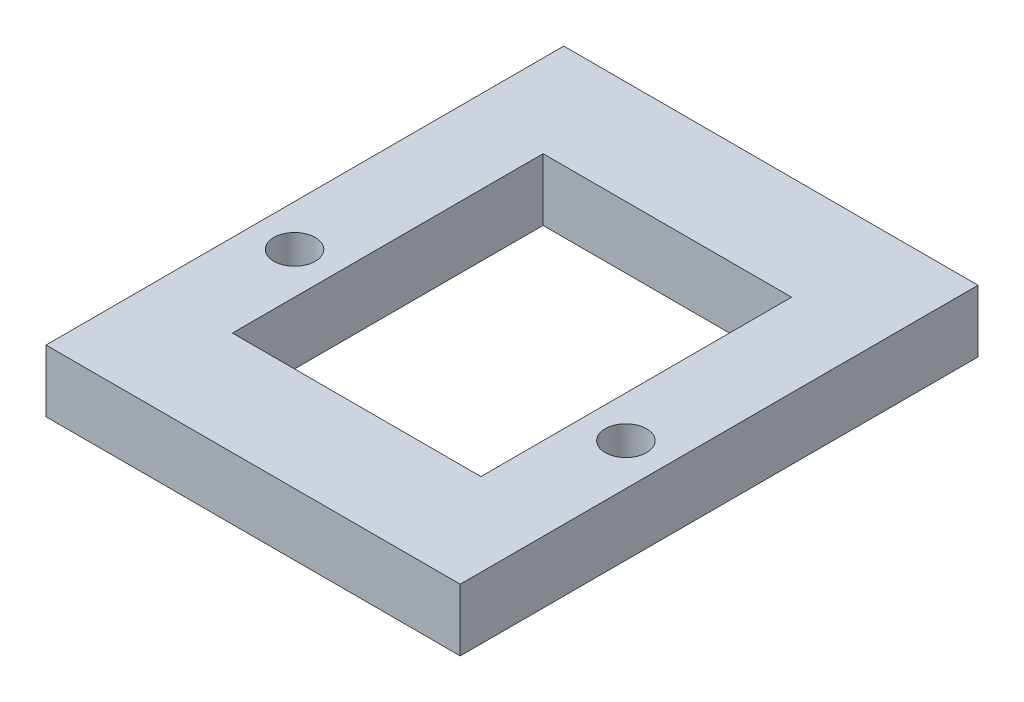
ISO-10303-21;
HEADER;
FILE_DESCRIPTION(('STEP AP214'),'2;1');
FILE_NAME('part.step','',(''),(''),'','','');
FILE_SCHEMA(('AUTOMOTIVE_DESIGN { 1 0 10303 214 1 1 1 1 }'));
ENDSEC;
DATA;
#1=APPLICATION_CONTEXT('core data for automotive mechanical design processes');
#2=APPLICATION_PROTOCOL_DEFINITION('international standard','automotive_design',2000,#1);
#3=PRODUCT_CONTEXT('',#1,'mechanical');
#4=PRODUCT('Part','Part','',(#3));
#5=PRODUCT_RELATED_PRODUCT_CATEGORY('part','',(#4));
#6=PRODUCT_DEFINITION_FORMATION('','',#4);
#7=PRODUCT_DEFINITION_CONTEXT('part definition',#1,'design');
#8=PRODUCT_DEFINITION('design','',#6,#7);
#9=PRODUCT_DEFINITION_SHAPE('','',#8);
#10=(LENGTH_UNIT() NAMED_UNIT(*) SI_UNIT(.MILLI.,.METRE.));
#11=(NAMED_UNIT(*) PLANE_ANGLE_UNIT() SI_UNIT($,.RADIAN.));
#12=(NAMED_UNIT(*) SI_UNIT($,.STERADIAN.) SOLID_ANGLE_UNIT());
#13=UNCERTAINTY_MEASURE_WITH_UNIT(LENGTH_MEASURE(1.E-05),#10,'distance_accuracy_value','');
#14=(GEOMETRIC_REPRESENTATION_CONTEXT(3) GLOBAL_UNCERTAINTY_ASSIGNED_CONTEXT((#13)) GLOBAL_UNIT_ASSIGNED_CONTEXT((#10,
#11,#12)) REPRESENTATION_CONTEXT('',''));
#15=CARTESIAN_POINT('',(0.,0.,0.));
#16=DIRECTION('',(0.,0.,1.));
#17=DIRECTION('',(1.,0.,0.));
#18=AXIS2_PLACEMENT_3D('',#15,#16,#17);
#19=CARTESIAN_POINT('',(0.,1.5,0.));
#20=DIRECTION('',(0.,1.,0.));
#21=DIRECTION('',(0.,0.,1.));
#22=AXIS2_PLACEMENT_3D('',#19,#20,#21);
#23=PLANE('',#22);
#24=CARTESIAN_POINT('',(-8.,1.5,2.50000000000001));
#25=DIRECTION('',(0.,1.,0.));
#26=DIRECTION('',(0.,0.,1.));
#27=AXIS2_PLACEMENT_3D('',#24,#25,#26);
#28=CIRCLE('',#27,1.);
#29=CARTESIAN_POINT('',(-8.,1.5,3.50000000000001));
#30=VERTEX_POINT('',#29);
#31=EDGE_CURVE('E127',#30,#30,#28,.T.);
#32=ORIENTED_EDGE('',*,*,#31,.F.);
#33=EDGE_LOOP('',(#32));
#34=FACE_BOUND('',#33,.T.);
#35=DIRECTION('',(0.,0.,-1.));
#36=VECTOR('',#35,1.);
#37=CARTESIAN_POINT('',(10.,1.5,-12.5));
#38=LINE('',#37,#36);
#39=CARTESIAN_POINT('',(10.,1.5,12.5));
#40=VERTEX_POINT('',#39);
#41=CARTESIAN_POINT('',(10.,1.5,-12.5));
#42=VERTEX_POINT('',#41);
#43=EDGE_CURVE('E137',#40,#42,#38,.T.);
#44=ORIENTED_EDGE('',*,*,#43,.T.);
#45=DIRECTION('',(-1.,0.,0.));
#46=VECTOR('',#45,1.);
#47=CARTESIAN_POINT('',(-10.,1.5,-12.5));
#48=LINE('',#47,#46);
#49=CARTESIAN_POINT('',(-10.,1.5,-12.5));
#50=VERTEX_POINT('',#49);
#51=EDGE_CURVE('E140',#42,#50,#48,.T.);
#52=ORIENTED_EDGE('',*,*,#51,.T.);
#53=DIRECTION('',(0.,0.,1.));
#54=VECTOR('',#53,1.);
#55=CARTESIAN_POINT('',(-10.,1.5,-12.5));
#56=LINE('',#55,#54);
#57=CARTESIAN_POINT('',(-10.,1.5,12.5));
#58=VERTEX_POINT('',#57);
#59=EDGE_CURVE('E143',#50,#58,#56,.T.);
#60=ORIENTED_EDGE('',*,*,#59,.T.);
#61=DIRECTION('',(1.,0.,0.));
#62=VECTOR('',#61,1.);
#63=CARTESIAN_POINT('',(-10.,1.5,12.5));
#64=LINE('',#63,#62);
#65=EDGE_CURVE('E145',#58,#40,#64,.T.);
#66=ORIENTED_EDGE('',*,*,#65,.T.);
#67=EDGE_LOOP('',(#44,#52,#60,#66));
#68=FACE_BOUND('',#67,.T.);
#69=DIRECTION('',(-1.,0.,0.));
#70=VECTOR('',#69,1.);
#71=CARTESIAN_POINT('',(-6.,1.5,-7.49999999999999));
#72=LINE('',#71,#70);
#73=CARTESIAN_POINT('',(6.,1.5,-7.49999999999999));
#74=VERTEX_POINT('',#73);
#75=CARTESIAN_POINT('',(-6.,1.5,-7.49999999999999));
#76=VERTEX_POINT('',#75);
#77=EDGE_CURVE('E106',#74,#76,#72,.T.);
#78=ORIENTED_EDGE('',*,*,#77,.F.);
#79=DIRECTION('',(0.,0.,-1.));
#80=VECTOR('',#79,1.);
#81=CARTESIAN_POINT('',(6.,1.5,-7.49999999999999));
#82=LINE('',#81,#80);
#83=CARTESIAN_POINT('',(6.,1.5,7.50000000000001));
#84=VERTEX_POINT('',#83);
#85=EDGE_CURVE('E98',#84,#74,#82,.T.);
#86=ORIENTED_EDGE('',*,*,#85,.F.);
#87=DIRECTION('',(1.,0.,0.));
#88=VECTOR('',#87,1.);
#89=CARTESIAN_POINT('',(-6.,1.5,7.50000000000001));
#90=LINE('',#89,#88);
#91=CARTESIAN_POINT('',(-6.,1.5,7.50000000000001));
#92=VERTEX_POINT('',#91);
#93=EDGE_CURVE('E121',#92,#84,#90,.T.);
#94=ORIENTED_EDGE('',*,*,#93,.F.);
#95=DIRECTION('',(0.,0.,1.));
#96=VECTOR('',#95,1.);
#97=CARTESIAN_POINT('',(-6.,1.5,-7.49999999999999));
#98=LINE('',#97,#96);
#99=EDGE_CURVE('E119',#76,#92,#98,.T.);
#100=ORIENTED_EDGE('',*,*,#99,.F.);
#101=EDGE_LOOP('',(#78,#86,#94,#100));
#102=FACE_BOUND('',#101,.T.);
#103=CARTESIAN_POINT('',(8.,1.5,2.50000000000001));
#104=DIRECTION('',(0.,1.,0.));
#105=DIRECTION('',(0.,0.,-1.));
#106=AXIS2_PLACEMENT_3D('',#103,#104,#105);
#107=CIRCLE('',#106,1.);
#108=CARTESIAN_POINT('',(8.,1.5,1.50000000000001));
#109=VERTEX_POINT('',#108);
#110=EDGE_CURVE('E227',#109,#109,#107,.T.);
#111=ORIENTED_EDGE('',*,*,#110,.F.);
#112=EDGE_LOOP('',(#111));
#113=FACE_BOUND('',#112,.T.);
#114=ADVANCED_FACE('F33',(#34,#68,#102,#113),#23,.T.);
#115=CARTESIAN_POINT('',(0.,-1.5,0.));
#116=DIRECTION('',(0.,1.,0.));
#117=DIRECTION('',(0.,0.,1.));
#118=AXIS2_PLACEMENT_3D('',#115,#116,#117);
#119=PLANE('',#118);
#120=DIRECTION('',(0.,0.,-1.));
#121=VECTOR('',#120,1.);
#122=CARTESIAN_POINT('',(10.,-1.5,-12.5));
#123=LINE('',#122,#121);
#124=CARTESIAN_POINT('',(10.,-1.5,12.5));
#125=VERTEX_POINT('',#124);
#126=CARTESIAN_POINT('',(10.,-1.5,-12.5));
#127=VERTEX_POINT('',#126);
#128=EDGE_CURVE('E114',#125,#127,#123,.T.);
#129=ORIENTED_EDGE('',*,*,#128,.F.);
#130=DIRECTION('',(1.,0.,0.));
#131=VECTOR('',#130,1.);
#132=CARTESIAN_POINT('',(-10.,-1.5,12.5));
#133=LINE('',#132,#131);
#134=CARTESIAN_POINT('',(-10.,-1.5,12.5));
#135=VERTEX_POINT('',#134);
#136=EDGE_CURVE('E141',#135,#125,#133,.T.);
#137=ORIENTED_EDGE('',*,*,#136,.F.);
#138=DIRECTION('',(0.,0.,1.));
#139=VECTOR('',#138,1.);
#140=CARTESIAN_POINT('',(-10.,-1.5,-12.5));
#141=LINE('',#140,#139);
#142=CARTESIAN_POINT('',(-10.,-1.5,-12.5));
#143=VERTEX_POINT('',#142);
#144=EDGE_CURVE('E152',#143,#135,#141,.T.);
#145=ORIENTED_EDGE('',*,*,#144,.F.);
#146=DIRECTION('',(-1.,0.,0.));
#147=VECTOR('',#146,1.);
#148=CARTESIAN_POINT('',(-10.,-1.5,-12.5));
#149=LINE('',#148,#147);
#150=EDGE_CURVE('E150',#127,#143,#149,.T.);
#151=ORIENTED_EDGE('',*,*,#150,.F.);
#152=EDGE_LOOP('',(#129,#137,#145,#151));
#153=FACE_BOUND('',#152,.T.);
#154=DIRECTION('',(0.,0.,-1.));
#155=VECTOR('',#154,1.);
#156=CARTESIAN_POINT('',(6.,-1.5,-7.49999999999999));
#157=LINE('',#156,#155);
#158=CARTESIAN_POINT('',(6.,-1.5,7.50000000000001));
#159=VERTEX_POINT('',#158);
#160=CARTESIAN_POINT('',(6.,-1.5,-7.49999999999999));
#161=VERTEX_POINT('',#160);
#162=EDGE_CURVE('E56',#159,#161,#157,.T.);
#163=ORIENTED_EDGE('',*,*,#162,.T.);
#164=DIRECTION('',(-1.,0.,0.));
#165=VECTOR('',#164,1.);
#166=CARTESIAN_POINT('',(-6.,-1.5,-7.49999999999999));
#167=LINE('',#166,#165);
#168=CARTESIAN_POINT('',(-6.,-1.5,-7.49999999999999));
#169=VERTEX_POINT('',#168);
#170=EDGE_CURVE('E113',#161,#169,#167,.T.);
#171=ORIENTED_EDGE('',*,*,#170,.T.);
#172=DIRECTION('',(0.,0.,1.));
#173=VECTOR('',#172,1.);
#174=CARTESIAN_POINT('',(-6.,-1.5,-7.49999999999999));
#175=LINE('',#174,#173);
#176=CARTESIAN_POINT('',(-6.,-1.5,7.50000000000001));
#177=VERTEX_POINT('',#176);
#178=EDGE_CURVE('E129',#169,#177,#175,.T.);
#179=ORIENTED_EDGE('',*,*,#178,.T.);
#180=DIRECTION('',(1.,0.,0.));
#181=VECTOR('',#180,1.);
#182=CARTESIAN_POINT('',(-6.,-1.5,7.50000000000001));
#183=LINE('',#182,#181);
#184=EDGE_CURVE('E107',#177,#159,#183,.T.);
#185=ORIENTED_EDGE('',*,*,#184,.T.);
#186=EDGE_LOOP('',(#163,#171,#179,#185));
#187=FACE_BOUND('',#186,.T.);
#188=CARTESIAN_POINT('',(-8.,-1.5,2.50000000000001));
#189=DIRECTION('',(0.,1.,0.));
#190=DIRECTION('',(0.,0.,1.));
#191=AXIS2_PLACEMENT_3D('',#188,#189,#190);
#192=CIRCLE('',#191,1.);
#193=CARTESIAN_POINT('',(-8.,-1.5,3.50000000000001));
#194=VERTEX_POINT('',#193);
#195=EDGE_CURVE('E233',#194,#194,#192,.T.);
#196=ORIENTED_EDGE('',*,*,#195,.T.);
#197=EDGE_LOOP('',(#196));
#198=FACE_BOUND('',#197,.T.);
#199=CARTESIAN_POINT('',(8.,-1.5,2.50000000000001));
#200=DIRECTION('',(0.,1.,0.));
#201=DIRECTION('',(0.,0.,-1.));
#202=AXIS2_PLACEMENT_3D('',#199,#200,#201);
#203=CIRCLE('',#202,1.);
#204=CARTESIAN_POINT('',(8.,-1.5,1.50000000000001));
#205=VERTEX_POINT('',#204);
#206=EDGE_CURVE('E230',#205,#205,#203,.T.);
#207=ORIENTED_EDGE('',*,*,#206,.T.);
#208=EDGE_LOOP('',(#207));
#209=FACE_BOUND('',#208,.T.);
#210=ADVANCED_FACE('F170',(#153,#187,#198,#209),#119,.F.);
#211=CARTESIAN_POINT('',(10.,1.5,-12.5));
#212=DIRECTION('',(-1.,0.,0.));
#213=DIRECTION('',(0.,0.,1.));
#214=AXIS2_PLACEMENT_3D('',#211,#212,#213);
#215=PLANE('',#214);
#216=ORIENTED_EDGE('',*,*,#128,.T.);
#217=DIRECTION('',(0.,-1.,0.));
#218=VECTOR('',#217,1.);
#219=CARTESIAN_POINT('',(10.,1.5,-12.5));
#220=LINE('',#219,#218);
#221=EDGE_CURVE('E11',#42,#127,#220,.T.);
#222=ORIENTED_EDGE('',*,*,#221,.F.);
#223=ORIENTED_EDGE('',*,*,#43,.F.);
#224=DIRECTION('',(0.,-1.,0.));
#225=VECTOR('',#224,1.);
#226=CARTESIAN_POINT('',(10.,1.5,12.5));
#227=LINE('',#226,#225);
#228=EDGE_CURVE('E147',#40,#125,#227,.T.);
#229=ORIENTED_EDGE('',*,*,#228,.T.);
#230=EDGE_LOOP('',(#216,#222,#223,#229));
#231=FACE_BOUND('',#230,.T.);
#232=ADVANCED_FACE('F35',(#231),#215,.F.);
#233=CARTESIAN_POINT('',(-10.,1.5,-12.5));
#234=DIRECTION('',(0.,0.,1.));
#235=DIRECTION('',(1.,0.,0.));
#236=AXIS2_PLACEMENT_3D('',#233,#234,#235);
#237=PLANE('',#236);
#238=ORIENTED_EDGE('',*,*,#150,.T.);
#239=DIRECTION('',(0.,-1.,0.));
#240=VECTOR('',#239,1.);
#241=CARTESIAN_POINT('',(-10.,1.5,-12.5));
#242=LINE('',#241,#240);
#243=EDGE_CURVE('E41',#50,#143,#242,.T.);
#244=ORIENTED_EDGE('',*,*,#243,.F.);
#245=ORIENTED_EDGE('',*,*,#51,.F.);
#246=ORIENTED_EDGE('',*,*,#221,.T.);
#247=EDGE_LOOP('',(#238,#244,#245,#246));
#248=FACE_BOUND('',#247,.T.);
#249=ADVANCED_FACE('F180',(#248),#237,.F.);
#250=CARTESIAN_POINT('',(-10.,1.5,-12.5));
#251=DIRECTION('',(1.,0.,0.));
#252=DIRECTION('',(0.,0.,-1.));
#253=AXIS2_PLACEMENT_3D('',#250,#251,#252);
#254=PLANE('',#253);
#255=ORIENTED_EDGE('',*,*,#144,.T.);
#256=DIRECTION('',(0.,-1.,0.));
#257=VECTOR('',#256,1.);
#258=CARTESIAN_POINT('',(-10.,1.5,12.5));
#259=LINE('',#258,#257);
#260=EDGE_CURVE('E157',#58,#135,#259,.T.);
#261=ORIENTED_EDGE('',*,*,#260,.F.);
#262=ORIENTED_EDGE('',*,*,#59,.F.);
#263=ORIENTED_EDGE('',*,*,#243,.T.);
#264=EDGE_LOOP('',(#255,#261,#262,#263));
#265=FACE_BOUND('',#264,.T.);
#266=ADVANCED_FACE('F164',(#265),#254,.F.);
#267=CARTESIAN_POINT('',(-10.,1.5,12.5));
#268=DIRECTION('',(0.,0.,-1.));
#269=DIRECTION('',(-1.,0.,0.));
#270=AXIS2_PLACEMENT_3D('',#267,#268,#269);
#271=PLANE('',#270);
#272=ORIENTED_EDGE('',*,*,#136,.T.);
#273=ORIENTED_EDGE('',*,*,#228,.F.);
#274=ORIENTED_EDGE('',*,*,#65,.F.);
#275=ORIENTED_EDGE('',*,*,#260,.T.);
#276=EDGE_LOOP('',(#272,#273,#274,#275));
#277=FACE_BOUND('',#276,.T.);
#278=ADVANCED_FACE('F174',(#277),#271,.F.);
#279=CARTESIAN_POINT('',(6.,1.5,-7.49999999999999));
#280=DIRECTION('',(-1.,0.,0.));
#281=DIRECTION('',(0.,0.,1.));
#282=AXIS2_PLACEMENT_3D('',#279,#280,#281);
#283=PLANE('',#282);
#284=ORIENTED_EDGE('',*,*,#162,.F.);
#285=DIRECTION('',(0.,-1.,0.));
#286=VECTOR('',#285,1.);
#287=CARTESIAN_POINT('',(6.,1.5,7.50000000000001));
#288=LINE('',#287,#286);
#289=EDGE_CURVE('E102',#84,#159,#288,.T.);
#290=ORIENTED_EDGE('',*,*,#289,.F.);
#291=ORIENTED_EDGE('',*,*,#85,.T.);
#292=DIRECTION('',(0.,-1.,0.));
#293=VECTOR('',#292,1.);
#294=CARTESIAN_POINT('',(6.,1.5,-7.49999999999999));
#295=LINE('',#294,#293);
#296=EDGE_CURVE('E101',#74,#161,#295,.T.);
#297=ORIENTED_EDGE('',*,*,#296,.T.);
#298=EDGE_LOOP('',(#284,#290,#291,#297));
#299=FACE_BOUND('',#298,.T.);
#300=ADVANCED_FACE('F100',(#299),#283,.T.);
#301=CARTESIAN_POINT('',(-6.,1.5,-7.49999999999999));
#302=DIRECTION('',(0.,0.,1.));
#303=DIRECTION('',(1.,0.,0.));
#304=AXIS2_PLACEMENT_3D('',#301,#302,#303);
#305=PLANE('',#304);
#306=ORIENTED_EDGE('',*,*,#170,.F.);
#307=ORIENTED_EDGE('',*,*,#296,.F.);
#308=ORIENTED_EDGE('',*,*,#77,.T.);
#309=DIRECTION('',(0.,-1.,0.));
#310=VECTOR('',#309,1.);
#311=CARTESIAN_POINT('',(-6.,1.5,-7.49999999999999));
#312=LINE('',#311,#310);
#313=EDGE_CURVE('E115',#76,#169,#312,.T.);
#314=ORIENTED_EDGE('',*,*,#313,.T.);
#315=EDGE_LOOP('',(#306,#307,#308,#314));
#316=FACE_BOUND('',#315,.T.);
#317=ADVANCED_FACE('F110',(#316),#305,.T.);
#318=CARTESIAN_POINT('',(-6.,1.5,-7.49999999999999));
#319=DIRECTION('',(1.,0.,0.));
#320=DIRECTION('',(0.,0.,-1.));
#321=AXIS2_PLACEMENT_3D('',#318,#319,#320);
#322=PLANE('',#321);
#323=ORIENTED_EDGE('',*,*,#178,.F.);
#324=ORIENTED_EDGE('',*,*,#313,.F.);
#325=ORIENTED_EDGE('',*,*,#99,.T.);
#326=DIRECTION('',(0.,-1.,0.));
#327=VECTOR('',#326,1.);
#328=CARTESIAN_POINT('',(-6.,1.5,7.50000000000001));
#329=LINE('',#328,#327);
#330=EDGE_CURVE('E48',#92,#177,#329,.T.);
#331=ORIENTED_EDGE('',*,*,#330,.T.);
#332=EDGE_LOOP('',(#323,#324,#325,#331));
#333=FACE_BOUND('',#332,.T.);
#334=ADVANCED_FACE('F205',(#333),#322,.T.);
#335=CARTESIAN_POINT('',(-6.,1.5,7.50000000000001));
#336=DIRECTION('',(0.,0.,-1.));
#337=DIRECTION('',(-1.,0.,0.));
#338=AXIS2_PLACEMENT_3D('',#335,#336,#337);
#339=PLANE('',#338);
#340=ORIENTED_EDGE('',*,*,#184,.F.);
#341=ORIENTED_EDGE('',*,*,#330,.F.);
#342=ORIENTED_EDGE('',*,*,#93,.T.);
#343=ORIENTED_EDGE('',*,*,#289,.T.);
#344=EDGE_LOOP('',(#340,#341,#342,#343));
#345=FACE_BOUND('',#344,.T.);
#346=ADVANCED_FACE('F209',(#345),#339,.T.);
#347=CARTESIAN_POINT('',(-8.,1.5,2.50000000000001));
#348=DIRECTION('',(0.,-1.,0.));
#349=DIRECTION('',(0.,0.,-1.));
#350=AXIS2_PLACEMENT_3D('',#347,#348,#349);
#351=CYLINDRICAL_SURFACE('',#350,1.);
#352=ORIENTED_EDGE('',*,*,#31,.T.);
#353=EDGE_LOOP('',(#352));
#354=FACE_BOUND('',#353,.T.);
#355=ORIENTED_EDGE('',*,*,#195,.F.);
#356=EDGE_LOOP('',(#355));
#357=FACE_BOUND('',#356,.T.);
#358=ADVANCED_FACE('F215',(#354,#357),#351,.F.);
#359=CARTESIAN_POINT('',(8.,1.5,2.50000000000001));
#360=DIRECTION('',(0.,-1.,0.));
#361=DIRECTION('',(0.,0.,-1.));
#362=AXIS2_PLACEMENT_3D('',#359,#360,#361);
#363=CYLINDRICAL_SURFACE('',#362,1.);
#364=ORIENTED_EDGE('',*,*,#110,.T.);
#365=EDGE_LOOP('',(#364));
#366=FACE_BOUND('',#365,.T.);
#367=ORIENTED_EDGE('',*,*,#206,.F.);
#368=EDGE_LOOP('',(#367));
#369=FACE_BOUND('',#368,.T.);
#370=ADVANCED_FACE('F218',(#366,#369),#363,.F.);
#371=CLOSED_SHELL('',(#114,#210,#232,#249,#266,#278,#300,#317,#334,#346,#358,#370));
#372=MANIFOLD_SOLID_BREP('B2',#371);
#373=ADVANCED_BREP_SHAPE_REPRESENTATION('',(#18,#372),#14);
#374=SHAPE_DEFINITION_REPRESENTATION(#9,#373);
ENDSEC;
END-ISO-10303-21;
